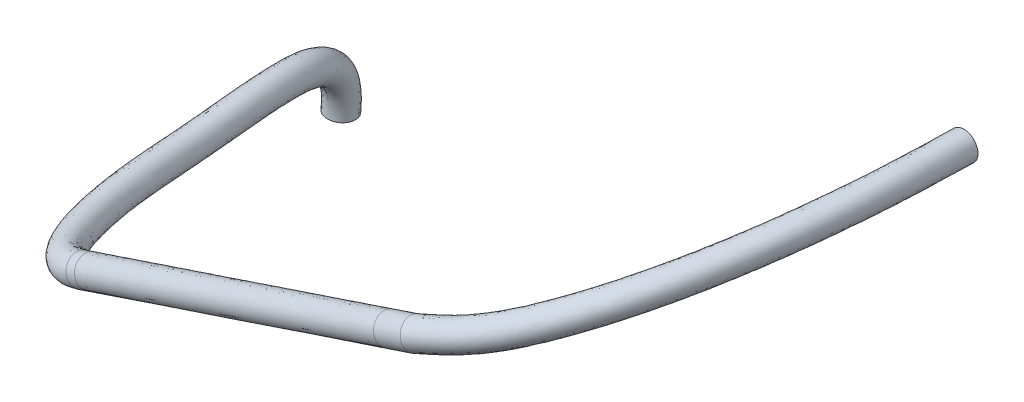
ISO-10303-21;
HEADER;
FILE_DESCRIPTION(('STEP AP214'),'2;1');
FILE_NAME('part.step','',(''),(''),'','','');
FILE_SCHEMA(('AUTOMOTIVE_DESIGN { 1 0 10303 214 1 1 1 1 }'));
ENDSEC;
DATA;
#1=APPLICATION_CONTEXT('core data for automotive mechanical design processes');
#2=APPLICATION_PROTOCOL_DEFINITION('international standard','automotive_design',2000,#1);
#3=PRODUCT_CONTEXT('',#1,'mechanical');
#4=PRODUCT('Part','Part','',(#3));
#5=PRODUCT_RELATED_PRODUCT_CATEGORY('part','',(#4));
#6=PRODUCT_DEFINITION_FORMATION('','',#4);
#7=PRODUCT_DEFINITION_CONTEXT('part definition',#1,'design');
#8=PRODUCT_DEFINITION('design','',#6,#7);
#9=PRODUCT_DEFINITION_SHAPE('','',#8);
#10=(LENGTH_UNIT() NAMED_UNIT(*) SI_UNIT(.MILLI.,.METRE.));
#11=(NAMED_UNIT(*) PLANE_ANGLE_UNIT() SI_UNIT($,.RADIAN.));
#12=(NAMED_UNIT(*) SI_UNIT($,.STERADIAN.) SOLID_ANGLE_UNIT());
#13=UNCERTAINTY_MEASURE_WITH_UNIT(LENGTH_MEASURE(1.E-05),#10,'distance_accuracy_value','');
#14=(GEOMETRIC_REPRESENTATION_CONTEXT(3) GLOBAL_UNCERTAINTY_ASSIGNED_CONTEXT((#13)) GLOBAL_UNIT_ASSIGNED_CONTEXT((#10,
#11,#12)) REPRESENTATION_CONTEXT('',''));
#15=CARTESIAN_POINT('',(0.,0.,0.));
#16=DIRECTION('',(0.,0.,1.));
#17=DIRECTION('',(1.,0.,0.));
#18=AXIS2_PLACEMENT_3D('',#15,#16,#17);
#19=CARTESIAN_POINT('',(81.1487898787396,61.1718176723532,90.0772563457402));
#20=CARTESIAN_POINT('',(82.8684623420464,57.4975112605607,86.2286481315393));
#21=CARTESIAN_POINT('',(81.7486279189325,61.2128646400633,82.1931883269978));
#22=CARTESIAN_POINT('',(80.0289554556256,64.8871710518557,86.0417965411987));
#23=CARTESIAN_POINT('',(78.3092829923188,68.5614774636482,89.8904047553996));
#24=CARTESIAN_POINT('',(79.4291174154327,64.8461240841457,93.9258645599411));
#25=CARTESIAN_POINT('',(81.1487898787396,61.1718176723532,90.0772563457402));
#26=(BOUNDED_CURVE() B_SPLINE_CURVE(3,(#19,#20,#21,#22,#23,#24,#25),.UNSPECIFIED.,.T.,
.F.) B_SPLINE_CURVE_WITH_KNOTS((4,3,4),(0.,0.5,1.),
.UNSPECIFIED.) CURVE() GEOMETRIC_REPRESENTATION_ITEM() RATIONAL_B_SPLINE_CURVE((1.,
0.333333333333333,0.333333333333333,1.,0.333333333333333,0.333333333333333,1.)) REPRESENTATION_ITEM(''));
#27=DIRECTION('',(-0.930375009445615,-0.359337532617031,-0.0726558975705086));
#28=VECTOR('',#27,1.);
#29=SURFACE_OF_LINEAR_EXTRUSION('',#26,#28);
#30=CARTESIAN_POINT('',(81.1487898787396,61.1718176723532,90.0772563457402));
#31=VERTEX_POINT('',#30);
#32=EDGE_CURVE('E44',#31,#31,#26,.F.);
#33=ORIENTED_EDGE('',*,*,#32,.T.);
#34=EDGE_LOOP('',(#33));
#35=FACE_BOUND('',#34,.T.);
#36=CARTESIAN_POINT('',(16.9410739490081,36.3729548665765,85.0630747689944));
#37=CARTESIAN_POINT('',(18.6607464123149,32.6986484547841,81.2144665547935));
#38=CARTESIAN_POINT('',(17.540911989201,36.4140018342866,77.179006750252));
#39=CARTESIAN_POINT('',(15.8212395258941,40.0883082460791,81.0276149644529));
#40=CARTESIAN_POINT('',(14.1015670625873,43.7626146578715,84.8762231786538));
#41=CARTESIAN_POINT('',(15.2214014857012,40.047261278369,88.9116829831953));
#42=CARTESIAN_POINT('',(16.9410739490081,36.3729548665765,85.0630747689944));
#43=(BOUNDED_CURVE() B_SPLINE_CURVE(3,(#36,#37,#38,#39,#40,#41,#42),.UNSPECIFIED.,.T.,
.F.) B_SPLINE_CURVE_WITH_KNOTS((4,3,4),(0.,0.5,1.),
.UNSPECIFIED.) CURVE() GEOMETRIC_REPRESENTATION_ITEM() RATIONAL_B_SPLINE_CURVE((1.,
0.333333333333333,0.333333333333333,1.,0.333333333333333,0.333333333333333,1.)) REPRESENTATION_ITEM(''));
#44=CARTESIAN_POINT('',(16.9410739490081,36.3729548665765,85.0630747689944));
#45=VERTEX_POINT('',#44);
#46=EDGE_CURVE('E10',#45,#45,#43,.F.);
#47=ORIENTED_EDGE('',*,*,#46,.F.);
#48=EDGE_LOOP('',(#47));
#49=FACE_BOUND('',#48,.T.);
#50=ADVANCED_FACE('F31',(#35,#49),#29,.F.);
#51=CARTESIAN_POINT('',(127.925962821787,82.0711595010635,18.81));
#52=CARTESIAN_POINT('',(127.823983410533,82.0828317957309,23.4719247681057));
#53=CARTESIAN_POINT('',(127.629593697571,82.1050811300045,32.3583284684436));
#54=CARTESIAN_POINT('',(125.682951111258,81.200997836729,44.9814579508211));
#55=CARTESIAN_POINT('',(122.694952336225,79.7214212513646,56.1367858951083));
#56=CARTESIAN_POINT('',(118.736979126685,77.7375754693454,65.7998466210036));
#57=CARTESIAN_POINT('',(114.040456126802,75.3827841757599,73.898083873457));
#58=CARTESIAN_POINT('',(108.740449221545,72.8307716458052,80.4351231122459));
#59=CARTESIAN_POINT('',(102.962150007868,69.9655958387675,85.5477060111618));
#60=CARTESIAN_POINT('',(95.4453699171,66.5124875820573,89.2722557636218));
#61=CARTESIAN_POINT('',(89.9003788054978,64.4870541830407,90.0722609856724));
#62=CARTESIAN_POINT('',(86.8044611116505,63.3562002336801,90.5189254207035));
#63=CARTESIAN_POINT('',(127.925962821787,87.6711595010636,18.81));
#64=CARTESIAN_POINT('',(127.842628451485,87.6809281054721,23.5882891743731));
#65=CARTESIAN_POINT('',(127.683779286505,87.6995486896045,32.6965027798207));
#66=CARTESIAN_POINT('',(125.755880367147,86.7582603622867,45.7088070545845));
#67=CARTESIAN_POINT('',(122.752764542969,85.2114045236135,57.2713491042322));
#68=CARTESIAN_POINT('',(118.727627037371,83.1268193710605,67.3512357283454));
#69=CARTESIAN_POINT('',(113.936600520975,80.6255240420923,75.8919718712892));
#70=CARTESIAN_POINT('',(108.392619492622,77.9025429718673,82.808945292704));
#71=CARTESIAN_POINT('',(102.537725110809,74.7419142966342,88.498015975164));
#72=CARTESIAN_POINT('',(94.4962399384647,70.6744029880479,92.9511883267719));
#73=CARTESIAN_POINT('',(88.7264873455061,68.4402324539288,93.8811389805609));
#74=CARTESIAN_POINT('',(85.5050792706968,67.192834947163,94.4003554455695));
#75=CARTESIAN_POINT('',(122.325962821787,87.6711595010636,18.81));
#76=CARTESIAN_POINT('',(122.247849491193,87.7057389780103,23.3945051131076));
#77=CARTESIAN_POINT('',(122.098952495947,87.7716532102601,32.1333340792153));
#78=CARTESIAN_POINT('',(120.275041320305,86.9705008892944,44.5162682266653));
#79=CARTESIAN_POINT('',(117.456709166976,85.624144716275,55.4486819783905));
#80=CARTESIAN_POINT('',(113.71629298745,83.800158808086,64.9043958174087));
#81=CARTESIAN_POINT('',(109.306268719857,81.6513943925075,72.8680608998156));
#82=CARTESIAN_POINT('',(104.294538163757,79.2753459191902,79.2210207630465));
#83=CARTESIAN_POINT('',(99.0311709998939,76.788726614224,84.5448095344949));
#84=CARTESIAN_POINT('',(92.400027639222,73.8226840719556,88.7121205325197));
#85=CARTESIAN_POINT('',(87.0654286178147,71.8784868845835,89.7577821041041));
#86=CARTESIAN_POINT('',(84.0869784873179,70.7929892973793,90.3416030870577));
#87=CARTESIAN_POINT('',(122.325962821787,82.0711595010635,18.81));
#88=CARTESIAN_POINT('',(122.229204450241,82.1076426682692,23.2781407068402));
#89=CARTESIAN_POINT('',(122.044766907013,82.1771856506601,31.7951597678383));
#90=CARTESIAN_POINT('',(120.202112064416,81.4132383637366,43.7889191229019));
#91=CARTESIAN_POINT('',(117.398896960232,80.1341614440261,54.3141187692666));
#92=CARTESIAN_POINT('',(113.725645076764,78.4109149063709,63.353006710067));
#93=CARTESIAN_POINT('',(109.410124325685,76.4086545261751,70.8741729019834));
#94=CARTESIAN_POINT('',(104.64236789268,74.2035745931281,76.8471985825884));
#95=CARTESIAN_POINT('',(99.455595896953,72.0124081563574,81.5944995704927));
#96=CARTESIAN_POINT('',(93.3491576178572,69.6607686659649,85.0331879693696));
#97=CARTESIAN_POINT('',(88.2393200778063,67.9253086136954,85.9489041092156));
#98=CARTESIAN_POINT('',(85.3863603282716,66.9563545838965,86.4601730621917));
#99=CARTESIAN_POINT('',(122.325962821787,76.4711595010635,18.81));
#100=CARTESIAN_POINT('',(122.210559409289,76.509546358528,23.1617763005728));
#101=CARTESIAN_POINT('',(121.990581318079,76.5827180910601,31.4569854564612));
#102=CARTESIAN_POINT('',(120.129182808528,75.8559758381788,43.0615700191385));
#103=CARTESIAN_POINT('',(117.341084753488,74.6441781717771,53.1795555601428));
#104=CARTESIAN_POINT('',(113.734997166078,73.0216710046558,61.8016176027252));
#105=CARTESIAN_POINT('',(109.513979931512,71.1659146598427,68.8802849041511));
#106=CARTESIAN_POINT('',(104.990197621603,69.131803267066,74.4733764021303));
#107=CARTESIAN_POINT('',(99.8800207940121,67.2360896984908,78.6441896064906));
#108=CARTESIAN_POINT('',(94.2982875964925,65.4988532599743,81.3542554062196));
#109=CARTESIAN_POINT('',(89.4132115377979,63.9721303428073,82.1400261143271));
#110=CARTESIAN_POINT('',(86.6857421692253,63.1197198704136,82.5787430373257));
#111=CARTESIAN_POINT('',(127.925962821787,76.4711595010635,18.81));
#112=CARTESIAN_POINT('',(127.805338369581,76.4847354859897,23.3555603618383));
#113=CARTESIAN_POINT('',(127.575408108637,76.5106135704046,32.0201541570666));
#114=CARTESIAN_POINT('',(125.61002185537,75.6437353111711,44.2541088470577));
#115=CARTESIAN_POINT('',(122.637140129481,74.2314379791157,55.0022226859844));
#116=CARTESIAN_POINT('',(118.746331216,72.3483315676303,64.2484575136619));
#117=CARTESIAN_POINT('',(114.14431173263,70.1400443094275,71.9041958756248));
#118=CARTESIAN_POINT('',(109.088278950468,67.7590003197431,78.0613009317878));
#119=CARTESIAN_POINT('',(103.386574904927,65.1892773809009,82.5973960471596));
#120=CARTESIAN_POINT('',(96.3944998957352,62.3505721760666,85.5933232004718));
#121=CARTESIAN_POINT('',(91.0742702654893,60.5338759121526,86.2633829907839));
#122=CARTESIAN_POINT('',(88.1038429526042,59.5195655201973,86.6374953958375));
#123=CARTESIAN_POINT('',(127.925962821787,82.0711595010635,18.81));
#124=CARTESIAN_POINT('',(127.823983410533,82.0828317957309,23.4719247681057));
#125=CARTESIAN_POINT('',(127.629593697571,82.1050811300045,32.3583284684436));
#126=CARTESIAN_POINT('',(125.682951111258,81.200997836729,44.9814579508211));
#127=CARTESIAN_POINT('',(122.694952336225,79.7214212513646,56.1367858951083));
#128=CARTESIAN_POINT('',(118.736979126685,77.7375754693454,65.7998466210036));
#129=CARTESIAN_POINT('',(114.040456126802,75.3827841757599,73.898083873457));
#130=CARTESIAN_POINT('',(108.740449221545,72.8307716458052,80.4351231122459));
#131=CARTESIAN_POINT('',(102.962150007868,69.9655958387675,85.5477060111618));
#132=CARTESIAN_POINT('',(95.4453699171,66.5124875820573,89.2722557636218));
#133=CARTESIAN_POINT('',(89.9003788054978,64.4870541830407,90.0722609856724));
#134=CARTESIAN_POINT('',(86.8044611116505,63.3562002336801,90.5189254207035));
#135=(BOUNDED_SURFACE() B_SPLINE_SURFACE(3,3,((#51,#52,#53,#54,#55,#56,#57,#58,#59,#60,#61,#62),
(#63,#64,#65,#66,#67,#68,#69,#70,#71,#72,#73,#74),(#75,#76,#77,#78,#79,#80,#81,#82,#83,#84,#85,
#86),(#87,#88,#89,#90,#91,#92,#93,#94,#95,#96,#97,#98),(#99,#100,#101,#102,#103,#104,#105,#106,
#107,#108,#109,#110),(#111,#112,#113,#114,#115,#116,#117,#118,#119,#120,#121,#122),(#123,#124,
#125,#126,#127,#128,#129,#130,#131,#132,#133,#134)),.UNSPECIFIED.,.T.,.F.,
.F.) B_SPLINE_SURFACE_WITH_KNOTS((4,3,4),(4,1,1,1,1,1,1,1,1,4),(0.,0.5,1.),(0.,0.1523876811027,
0.290476256181029,0.415797899749065,0.529647461180281,0.633091550657314,0.725417629481519,
0.80947455062777,0.893624516619064,1.),
.UNSPECIFIED.) GEOMETRIC_REPRESENTATION_ITEM() RATIONAL_B_SPLINE_SURFACE(((1.,1.,1.,1.,1.,1.,1.,
1.,1.,1.,1.,1.),(0.333333333333333,0.333333333333333,0.333333333333333,0.333333333333333,
0.333333333333333,0.333333333333333,0.333333333333333,0.333333333333333,0.333333333333333,
0.333333333333333,0.333333333333333,0.333333333333333),(0.333333333333333,0.333333333333333,
0.333333333333333,0.333333333333333,0.333333333333333,0.333333333333333,0.333333333333333,
0.333333333333333,0.333333333333333,0.333333333333333,0.333333333333333,0.333333333333333),(1.,
1.,1.,1.,1.,1.,1.,1.,1.,1.,1.,1.),(0.333333333333333,0.333333333333333,0.333333333333333,
0.333333333333333,0.333333333333333,0.333333333333333,0.333333333333333,0.333333333333333,
0.333333333333333,0.333333333333333,0.333333333333333,0.333333333333333),(0.333333333333333,
0.333333333333333,0.333333333333333,0.333333333333333,0.333333333333333,0.333333333333333,
0.333333333333333,0.333333333333333,0.333333333333333,0.333333333333333,0.333333333333333,
0.333333333333333),(1.,1.,1.,1.,1.,1.,1.,1.,1.,1.,1.,1.))) REPRESENTATION_ITEM('') SURFACE());
#136=CARTESIAN_POINT('',(125.125962821787,82.0711595010635,18.81));
#137=DIRECTION('',(0.,0.,1.));
#138=DIRECTION('',(1.,0.,0.));
#139=AXIS2_PLACEMENT_3D('',#136,#137,#138);
#140=CIRCLE('',#139,2.80000000000003);
#141=CARTESIAN_POINT('',(127.925962821787,82.0711595010635,18.81));
#142=VERTEX_POINT('',#141);
#143=EDGE_CURVE('E40',#142,#142,#140,.T.);
#144=CARTESIAN_POINT('',(86.8044611116505,63.3562002336801,90.5189254207035));
#145=CARTESIAN_POINT('',(88.1038429526042,59.5195655201973,86.6374953958375));
#146=CARTESIAN_POINT('',(86.6857421692253,63.1197198704136,82.5787430373257));
#147=CARTESIAN_POINT('',(85.3863603282716,66.9563545838965,86.4601730621917));
#148=CARTESIAN_POINT('',(84.0869784873179,70.7929892973793,90.3416030870577));
#149=CARTESIAN_POINT('',(85.5050792706968,67.192834947163,94.4003554455695));
#150=CARTESIAN_POINT('',(86.8044611116505,63.3562002336801,90.5189254207035));
#151=(BOUNDED_CURVE() B_SPLINE_CURVE(3,(#144,#145,#146,#147,#148,#149,#150),.UNSPECIFIED.,.T.,
.F.) B_SPLINE_CURVE_WITH_KNOTS((4,3,4),(0.,0.5,1.),
.UNSPECIFIED.) CURVE() GEOMETRIC_REPRESENTATION_ITEM() RATIONAL_B_SPLINE_CURVE((1.,
0.333333333333333,0.333333333333333,1.,0.333333333333333,0.333333333333333,1.)) REPRESENTATION_ITEM(''));
#152=CARTESIAN_POINT('',(86.8044611116505,63.3562002336801,90.5189254207035));
#153=VERTEX_POINT('',#152);
#154=EDGE_CURVE('E48',#153,#153,#151,.T.);
#155=ORIENTED_EDGE('',*,*,#143,.T.);
#156=EDGE_LOOP('',(#155));
#157=FACE_BOUND('',#156,.T.);
#158=ORIENTED_EDGE('',*,*,#154,.T.);
#159=EDGE_LOOP('',(#158));
#160=FACE_BOUND('',#159,.T.);
#161=ADVANCED_FACE('F97',(#157,#160),#135,.T.);
#162=CARTESIAN_POINT('',(125.125962821787,82.0711595010635,18.81));
#163=DIRECTION('',(0.,0.,1.));
#164=DIRECTION('',(1.,0.,0.));
#165=AXIS2_PLACEMENT_3D('',#162,#163,#164);
#166=PLANE('',#165);
#167=ORIENTED_EDGE('',*,*,#143,.F.);
#168=EDGE_LOOP('',(#167));
#169=FACE_BOUND('',#168,.T.);
#170=ADVANCED_FACE('F102',(#169),#166,.F.);
#171=CARTESIAN_POINT('',(86.8044611116505,63.3562002336801,90.5189254207035));
#172=CARTESIAN_POINT('',(81.1487898787396,61.1718176723532,90.0772563457402));
#173=CARTESIAN_POINT('',(88.1038429526042,59.5195655201973,86.6374953958375));
#174=CARTESIAN_POINT('',(82.8684623420464,57.4975112605607,86.2286481315393));
#175=CARTESIAN_POINT('',(86.6857421692253,63.1197198704136,82.5787430373257));
#176=CARTESIAN_POINT('',(81.7486279189325,61.2128646400633,82.1931883269978));
#177=CARTESIAN_POINT('',(85.3863603282716,66.9563545838965,86.4601730621917));
#178=CARTESIAN_POINT('',(80.0289554556256,64.8871710518557,86.0417965411987));
#179=CARTESIAN_POINT('',(84.0869784873179,70.7929892973793,90.3416030870577));
#180=CARTESIAN_POINT('',(78.3092829923188,68.5614774636482,89.8904047553996));
#181=CARTESIAN_POINT('',(85.5050792706968,67.192834947163,94.4003554455695));
#182=CARTESIAN_POINT('',(79.4291174154327,64.8461240841457,93.9258645599411));
#183=CARTESIAN_POINT('',(86.8044611116505,63.3562002336801,90.5189254207035));
#184=CARTESIAN_POINT('',(81.1487898787396,61.1718176723532,90.0772563457402));
#185=(BOUNDED_SURFACE() B_SPLINE_SURFACE(3,1,((#171,#172),(#173,#174),(#175,#176),(#177,#178),
(#179,#180),(#181,#182),(#183,#184)),.UNSPECIFIED.,.T.,.F.,.F.) B_SPLINE_SURFACE_WITH_KNOTS((4,
3,4),(2,2),(0.,0.5,1.),(0.,1.),
.UNSPECIFIED.) GEOMETRIC_REPRESENTATION_ITEM() RATIONAL_B_SPLINE_SURFACE(((1.,1.),
(0.333333333333333,0.333333333333333),(0.333333333333333,0.333333333333333),(1.,1.),
(0.333333333333333,0.333333333333333),(0.333333333333333,0.333333333333333),(1.,1.))) REPRESENTATION_ITEM('') SURFACE());
#186=ORIENTED_EDGE('',*,*,#154,.F.);
#187=EDGE_LOOP('',(#186));
#188=FACE_BOUND('',#187,.T.);
#189=ORIENTED_EDGE('',*,*,#32,.F.);
#190=EDGE_LOOP('',(#189));
#191=FACE_BOUND('',#190,.T.);
#192=ADVANCED_FACE('F94',(#188,#191),#185,.F.);
#193=CARTESIAN_POINT('',(16.9410739490081,36.3729548665765,85.0630747689944));
#194=CARTESIAN_POINT('',(15.0916055474745,35.6586370857752,84.9186439906765));
#195=CARTESIAN_POINT('',(15.2214014857012,40.047261278369,88.9116829831953));
#196=CARTESIAN_POINT('',(13.406735895858,39.3463853423657,88.7699700654129));
#197=CARTESIAN_POINT('',(14.1015670625873,43.7626146578715,84.8762231786538));
#198=CARTESIAN_POINT('',(12.288018793997,43.0621702634058,84.7345975159864));
#199=CARTESIAN_POINT('',(15.8212395258941,40.0883082460791,81.0276149644529));
#200=CARTESIAN_POINT('',(13.9728884456134,39.3744220068153,80.8832714412501));
#201=CARTESIAN_POINT('',(17.540911989201,36.4140018342866,77.179006750252));
#202=CARTESIAN_POINT('',(15.6577580972299,35.6866737502248,77.0319453665137));
#203=CARTESIAN_POINT('',(18.6607464123149,32.6986484547841,81.2144665547935));
#204=CARTESIAN_POINT('',(16.776475199091,31.9708888291846,81.0673179159402));
#205=CARTESIAN_POINT('',(16.9410739490081,36.3729548665765,85.0630747689944));
#206=CARTESIAN_POINT('',(15.0916055474745,35.6586370857752,84.9186439906765));
#207=(BOUNDED_SURFACE() B_SPLINE_SURFACE(3,1,((#193,#194),(#195,#196),(#197,#198),(#199,#200),
(#201,#202),(#203,#204),(#205,#206)),.UNSPECIFIED.,.T.,.F.,.F.) B_SPLINE_SURFACE_WITH_KNOTS((4,
3,4),(2,2),(0.,0.5,1.),(0.,1.),
.UNSPECIFIED.) GEOMETRIC_REPRESENTATION_ITEM() RATIONAL_B_SPLINE_SURFACE(((1.,1.),
(0.333333333333333,0.333333333333333),(0.333333333333333,0.333333333333333),(1.,1.),
(0.333333333333333,0.333333333333333),(0.333333333333333,0.333333333333333),(1.,1.))) REPRESENTATION_ITEM('') SURFACE());
#208=CARTESIAN_POINT('',(15.0916055474745,35.6586370857752,84.9186439906765));
#209=CARTESIAN_POINT('',(16.776475199091,31.9708888291846,81.0673179159402));
#210=CARTESIAN_POINT('',(15.6577580972299,35.6866737502248,77.0319453665137));
#211=CARTESIAN_POINT('',(13.9728884456134,39.3744220068153,80.8832714412501));
#212=CARTESIAN_POINT('',(12.288018793997,43.0621702634058,84.7345975159864));
#213=CARTESIAN_POINT('',(13.406735895858,39.3463853423657,88.7699700654129));
#214=CARTESIAN_POINT('',(15.0916055474745,35.6586370857752,84.9186439906765));
#215=(BOUNDED_CURVE() B_SPLINE_CURVE(3,(#208,#209,#210,#211,#212,#213,#214),.UNSPECIFIED.,.T.,
.F.) B_SPLINE_CURVE_WITH_KNOTS((4,3,4),(0.,0.5,1.),
.UNSPECIFIED.) CURVE() GEOMETRIC_REPRESENTATION_ITEM() RATIONAL_B_SPLINE_CURVE((1.,
0.333333333333333,0.333333333333333,1.,0.333333333333333,0.333333333333333,1.)) REPRESENTATION_ITEM(''));
#216=CARTESIAN_POINT('',(15.0916055474745,35.6586370857752,84.9186439906765));
#217=VERTEX_POINT('',#216);
#218=EDGE_CURVE('E68',#217,#217,#215,.T.);
#219=ORIENTED_EDGE('',*,*,#46,.T.);
#220=EDGE_LOOP('',(#219));
#221=FACE_BOUND('',#220,.T.);
#222=ORIENTED_EDGE('',*,*,#218,.T.);
#223=EDGE_LOOP('',(#222));
#224=FACE_BOUND('',#223,.T.);
#225=ADVANCED_FACE('F80',(#221,#224),#207,.T.);
#226=CARTESIAN_POINT('',(-3.58870525397693,19.3799806151552,9.68126563882055));
#227=DIRECTION('',(-0.0589225886440151,-0.997245334327439,0.0450540975899289));
#228=DIRECTION('',(0.998259017870274,-0.0589824824899461,0.));
#229=AXIS2_PLACEMENT_3D('',#226,#227,#228);
#230=PLANE('',#229);
#231=CARTESIAN_POINT('',(-6.34580805392456,19.7623383869717,14.5387343611794));
#232=CARTESIAN_POINT('',(-1.49424413226242,19.6010955640268,17.31468725006));
#233=CARTESIAN_POINT('',(1.26285866768524,19.2187377922104,12.4572185277012));
#234=CARTESIAN_POINT('',(-3.58870525397693,19.3799806151552,9.68126563882055));
#235=CARTESIAN_POINT('',(-8.44026917563902,19.5412234381001,6.90531274993987));
#236=CARTESIAN_POINT('',(-11.1973719755867,19.9235812099165,11.7627814722987));
#237=CARTESIAN_POINT('',(-6.34580805392456,19.7623383869717,14.5387343611794));
#238=(BOUNDED_CURVE() B_SPLINE_CURVE(3,(#231,#232,#233,#234,#235,#236,#237),.UNSPECIFIED.,.T.,
.F.) B_SPLINE_CURVE_WITH_KNOTS((4,3,4),(0.,0.5,1.),
.UNSPECIFIED.) CURVE() GEOMETRIC_REPRESENTATION_ITEM() RATIONAL_B_SPLINE_CURVE((1.,
0.333333333333333,0.333333333333333,1.,0.333333333333333,0.333333333333333,1.)) REPRESENTATION_ITEM(''));
#239=CARTESIAN_POINT('',(-6.34580805392456,19.7623383869717,14.5387343611794));
#240=VERTEX_POINT('',#239);
#241=EDGE_CURVE('E60',#240,#240,#238,.F.);
#242=ORIENTED_EDGE('',*,*,#241,.T.);
#243=EDGE_LOOP('',(#242));
#244=FACE_BOUND('',#243,.T.);
#245=ADVANCED_FACE('F85',(#244),#230,.T.);
#246=CARTESIAN_POINT('',(15.0916055474745,35.6586370857752,84.9186439906765));
#247=CARTESIAN_POINT('',(14.4273065334605,35.4096595534953,84.8733351624054));
#248=CARTESIAN_POINT('',(12.6409253101334,34.7655393437095,84.5921666598122));
#249=CARTESIAN_POINT('',(10.4698919916281,34.0285965469515,83.6428127037452));
#250=CARTESIAN_POINT('',(8.1405537702827,33.2908141864133,82.0104105205428));
#251=CARTESIAN_POINT('',(5.96680963659307,32.6775421016906,79.5631192173669));
#252=CARTESIAN_POINT('',(3.34694315379664,32.0533467679456,75.1656243302604));
#253=CARTESIAN_POINT('',(1.08503986924065,31.7514194357975,68.9834357178448));
#254=CARTESIAN_POINT('',(-1.53977976970221,31.8400706894773,58.6094779221342));
#255=CARTESIAN_POINT('',(-2.41345021588255,30.9918898220495,44.3631675275283));
#256=CARTESIAN_POINT('',(-3.8064444102828,31.6930785120833,31.5680604268983));
#257=CARTESIAN_POINT('',(-4.60555026678838,30.4666596032205,23.4696961394359));
#258=CARTESIAN_POINT('',(-5.02882905036672,29.5626452581332,20.2380937845374));
#259=CARTESIAN_POINT('',(-5.36233988923994,28.392567473471,18.0421359626241));
#260=CARTESIAN_POINT('',(-5.6005526182333,27.2136696903821,16.708567085588));
#261=CARTESIAN_POINT('',(-5.76655868997784,26.192513433301,15.8950342350056));
#262=CARTESIAN_POINT('',(-5.92517998666703,24.977158525568,15.249793163342));
#263=CARTESIAN_POINT('',(-6.07691115714467,23.5260646937247,14.7806892527424));
#264=CARTESIAN_POINT('',(-6.22527431074715,21.7268393963454,14.5191790480603));
#265=CARTESIAN_POINT('',(-6.29963187812591,20.5438548975665,14.5034265789071));
#266=CARTESIAN_POINT('',(-6.34580805392456,19.7623383869717,14.5387343611794));
#267=CARTESIAN_POINT('',(16.776475199091,31.9708888291846,81.0673179159402));
#268=CARTESIAN_POINT('',(16.5462151775183,31.8845879755864,81.0516129223227));
#269=CARTESIAN_POINT('',(14.919906634857,31.2749526955553,80.8572867117918));
#270=CARTESIAN_POINT('',(13.5556984063791,30.8005508048547,80.2368692273197));
#271=CARTESIAN_POINT('',(11.8347671578923,30.2244962861226,79.111145463405));
#272=CARTESIAN_POINT('',(10.1337485213269,29.6997948135081,77.2756696079367));
#273=CARTESIAN_POINT('',(7.82750280671491,29.0446659041971,73.6365692856414));
#274=CARTESIAN_POINT('',(5.50019354439078,28.3897969997291,68.0751266929208));
#275=CARTESIAN_POINT('',(2.03320180374379,27.4747262106418,58.3537592557466));
#276=CARTESIAN_POINT('',(1.75435739588179,27.2777429729811,44.209443878826));
#277=CARTESIAN_POINT('',(-0.176893588889569,27.4117945399064,31.078157141209));
#278=CARTESIAN_POINT('',(-0.455683158346842,26.7116623991058,23.6393012453005));
#279=CARTESIAN_POINT('',(-0.758305902396016,25.9947367604077,20.9232235830097));
#280=CARTESIAN_POINT('',(-0.952190591708357,25.1925169937133,19.3891150701557));
#281=CARTESIAN_POINT('',(-1.06856287852151,24.5282910334566,18.6173554815354));
#282=CARTESIAN_POINT('',(-1.1430669610796,24.0025319683408,18.1801590956322));
#283=CARTESIAN_POINT('',(-1.21988399937098,23.3375397866139,17.8176837200163));
#284=CARTESIAN_POINT('',(-1.30215771211609,22.4973786543643,17.5096733615195));
#285=CARTESIAN_POINT('',(-1.41476639555151,21.0025315801503,17.3193717511541));
#286=CARTESIAN_POINT('',(-1.43117613004102,20.6685006527718,17.26646343654));
#287=CARTESIAN_POINT('',(-1.49424413226242,19.6010955640268,17.31468725006));
#288=CARTESIAN_POINT('',(15.6577580972299,35.6866737502248,77.0319453665137));
#289=CARTESIAN_POINT('',(15.4274980756573,35.6003728966266,77.0162403728963));
#290=CARTESIAN_POINT('',(14.7754177716139,35.3291511490747,76.9263788657681));
#291=CARTESIAN_POINT('',(14.1288399633744,35.0781415744632,76.6466658973668));
#292=CARTESIAN_POINT('',(13.2850378542538,34.7539865090007,76.0852878301814));
#293=CARTESIAN_POINT('',(12.210894555927,34.3601646965442,74.9231403633161));
#294=CARTESIAN_POINT('',(10.5036095646843,33.747865874917,72.0884192221417));
#295=CARTESIAN_POINT('',(8.71544871351802,32.8915022828229,67.0383047504924));
#296=CARTESIAN_POINT('',(6.35936377939834,31.0537133455059,57.6587803506289));
#297=CARTESIAN_POINT('',(5.46101233131592,31.4402846525455,43.8924158604858));
#298=CARTESIAN_POINT('',(4.07424357549352,31.1341229888738,30.8209000803369));
#299=CARTESIAN_POINT('',(3.22761540309923,30.7612864818801,22.4141191275151));
#300=CARTESIAN_POINT('',(2.76938978483998,29.9183436415504,18.975117600708));
#301=CARTESIAN_POINT('',(2.39496813730723,28.7151593413362,16.5372615595863));
#302=CARTESIAN_POINT('',(2.11754067824637,27.4103577958986,14.9986626892211));
#303=CARTESIAN_POINT('',(1.9218808816968,26.2571389584207,14.0461646634684));
#304=CARTESIAN_POINT('',(1.7353989686012,24.873384314254,13.2921781646856));
#305=CARTESIAN_POINT('',(1.56237594217819,23.2832835741078,12.7495684628274));
#306=CARTESIAN_POINT('',(1.38977899555274,21.204615847952,12.4573702967968));
#307=CARTESIAN_POINT('',(1.32592666990665,20.2861428809554,12.4089947141812));
#308=CARTESIAN_POINT('',(1.26285866768524,19.2187377922104,12.4572185277012));
#309=CARTESIAN_POINT('',(13.9728884456134,39.3744220068153,80.8832714412501));
#310=CARTESIAN_POINT('',(13.5256089278201,39.2067828138763,80.8527645303058));
#311=CARTESIAN_POINT('',(12.4007766845518,38.7838847685762,80.6547342944803));
#312=CARTESIAN_POINT('',(11.0675297506549,38.3153684290752,80.054280148827));
#313=CARTESIAN_POINT('',(9.58024533378637,37.8163393775716,78.9838313325822));
#314=CARTESIAN_POINT('',(8.04744483724665,37.3392197175647,77.210827952839));
#315=CARTESIAN_POINT('',(6.0207740343114,36.7556937306719,73.6173190402219));
#316=CARTESIAN_POINT('',(4.30111282838729,36.2534313612126,67.946669546289));
#317=CARTESIAN_POINT('',(2.78588998797041,35.4188725809052,57.9144654833734));
#318=CARTESIAN_POINT('',(1.29340566170862,35.1545134269309,44.0461528817717));
#319=CARTESIAN_POINT('',(0.444680895250333,35.4153841486353,31.310803481506));
#320=CARTESIAN_POINT('',(-0.922249892889294,34.5162969668652,22.2445135111224));
#321=CARTESIAN_POINT('',(-1.50113624391051,33.4862075847206,18.289989793531));
#322=CARTESIAN_POINT('',(-2.01517411120749,31.9153286428586,15.1902770863317));
#323=CARTESIAN_POINT('',(-2.41446077297982,30.0955383281866,13.0898832438002));
#324=CARTESIAN_POINT('',(-2.70156505608963,28.4478953979195,11.7610047907443));
#325=CARTESIAN_POINT('',(-2.97008199154585,26.5098724562083,10.7244290438047));
#326=CARTESIAN_POINT('',(-3.21159217066963,24.32526109873,10.0199838640387));
#327=CARTESIAN_POINT('',(-3.42419476027147,21.8702654580145,9.65982768636183));
#328=CARTESIAN_POINT('',(-3.5340831649669,20.3044414148252,9.63949984092441));
#329=CARTESIAN_POINT('',(-3.58870525397693,19.3799806151552,9.68126563882055));
#330=CARTESIAN_POINT('',(12.288018793997,43.0621702634058,84.7345975159864));
#331=CARTESIAN_POINT('',(11.623719779983,42.813192731126,84.6892886877153));
#332=CARTESIAN_POINT('',(10.0261355974897,42.2386183880776,84.3830897231926));
#333=CARTESIAN_POINT('',(8.00621953793536,41.5525952836873,83.461894400287));
#334=CARTESIAN_POINT('',(5.87545281331904,40.8786922461425,81.882374834983));
#335=CARTESIAN_POINT('',(3.88399511856641,40.3182747385851,79.4985155423618));
#336=CARTESIAN_POINT('',(1.53793850393854,39.7635215864269,75.1462188583021));
#337=CARTESIAN_POINT('',(-0.113223056743408,39.6153604396022,68.8550343420857));
#338=CARTESIAN_POINT('',(-0.787583803457447,39.7840318163045,58.1701506161179));
#339=CARTESIAN_POINT('',(-2.87420100789855,38.8687422013164,44.1998899030576));
#340=CARTESIAN_POINT('',(-3.18488178499286,39.6966453083969,31.8007068826752));
#341=CARTESIAN_POINT('',(-5.07211518887773,38.2713074518502,22.0749078947297));
#342=CARTESIAN_POINT('',(-5.77166227266091,37.0540715278909,17.6048619863539));
#343=CARTESIAN_POINT('',(-6.42531635972217,35.1154979443811,13.8432926130771));
#344=CARTESIAN_POINT('',(-6.94646222420594,32.7807188604746,11.1811037983793));
#345=CARTESIAN_POINT('',(-7.32501099387603,30.6386518374184,9.47584491802024));
#346=CARTESIAN_POINT('',(-7.67556295169283,28.1463605981626,8.15667992292375));
#347=CARTESIAN_POINT('',(-7.98556028351739,25.3672386233521,7.29039926525006));
#348=CARTESIAN_POINT('',(-8.23816851609565,22.5359150680771,6.86228507592685));
#349=CARTESIAN_POINT('',(-8.39409299984037,20.322739948695,6.87000496766758));
#350=CARTESIAN_POINT('',(-8.44026917563902,19.5412234381001,6.90531274993987));
#351=CARTESIAN_POINT('',(13.406735895858,39.3463853423657,88.7699700654129));
#352=CARTESIAN_POINT('',(12.3083978894028,38.9347311314041,88.695057402488));
#353=CARTESIAN_POINT('',(10.3619439854097,38.2561259918638,88.3270466078327));
#354=CARTESIAN_POINT('',(7.38408557687718,37.2566422890482,87.0487561801705));
#355=CARTESIAN_POINT('',(4.44634038267309,36.357132086704,84.9096755776807));
#356=CARTESIAN_POINT('',(1.79987075185929,35.655289389873,81.850568826797));
#357=CARTESIAN_POINT('',(-1.13361649912165,35.0620276316941,76.6946793748795));
#358=CARTESIAN_POINT('',(-3.33011380590947,35.1130418718659,69.8917447427689));
#359=CARTESIAN_POINT('',(-5.11276134314822,36.205415168313,58.8651965885218));
#360=CARTESIAN_POINT('',(-6.58125782764685,34.7060366711178,44.5168911762308));
#361=CARTESIAN_POINT('',(-7.43599523167606,35.9743624842602,32.0579637125875));
#362=CARTESIAN_POINT('',(-8.75541737522992,34.2216568073352,23.3000910335714));
#363=CARTESIAN_POINT('',(-9.29935219833745,33.1305537558588,19.5529639860651));
#364=CARTESIAN_POINT('',(-9.77248918677151,31.5926179532286,16.6951568550925));
#365=CARTESIAN_POINT('',(-10.1325423579451,29.8990483473075,14.7997786896405));
#366=CARTESIAN_POINT('',(-10.3900504188761,28.3824948982612,13.6099093743789));
#367=CARTESIAN_POINT('',(-10.6304759739631,26.6167772645222,12.6819026066678));
#368=CARTESIAN_POINT('',(-10.8516646021733,24.5547507330851,12.0517051439654));
#369=CARTESIAN_POINT('',(-11.0357822259428,22.4511472125404,11.7189863449666));
#370=CARTESIAN_POINT('',(-11.1680876262108,20.4192091423612,11.7403897212742));
#371=CARTESIAN_POINT('',(-11.1973719755867,19.9235812099165,11.7627814722987));
#372=CARTESIAN_POINT('',(15.0916055474745,35.6586370857752,84.9186439906765));
#373=CARTESIAN_POINT('',(14.4273065334605,35.4096595534953,84.8733351624054));
#374=CARTESIAN_POINT('',(12.6409253101334,34.7655393437095,84.5921666598122));
#375=CARTESIAN_POINT('',(10.4698919916281,34.0285965469515,83.6428127037452));
#376=CARTESIAN_POINT('',(8.1405537702827,33.2908141864133,82.0104105205428));
#377=CARTESIAN_POINT('',(5.96680963659307,32.6775421016906,79.5631192173669));
#378=CARTESIAN_POINT('',(3.34694315379664,32.0533467679456,75.1656243302604));
#379=CARTESIAN_POINT('',(1.08503986924065,31.7514194357975,68.9834357178448));
#380=CARTESIAN_POINT('',(-1.53977976970221,31.8400706894773,58.6094779221342));
#381=CARTESIAN_POINT('',(-2.41345021588255,30.9918898220495,44.3631675275283));
#382=CARTESIAN_POINT('',(-3.8064444102828,31.6930785120833,31.5680604268983));
#383=CARTESIAN_POINT('',(-4.60555026678838,30.4666596032205,23.4696961394359));
#384=CARTESIAN_POINT('',(-5.02882905036672,29.5626452581332,20.2380937845374));
#385=CARTESIAN_POINT('',(-5.36233988923994,28.392567473471,18.0421359626241));
#386=CARTESIAN_POINT('',(-5.6005526182333,27.2136696903821,16.708567085588));
#387=CARTESIAN_POINT('',(-5.76655868997784,26.192513433301,15.8950342350056));
#388=CARTESIAN_POINT('',(-5.92517998666703,24.977158525568,15.249793163342));
#389=CARTESIAN_POINT('',(-6.07691115714467,23.5260646937247,14.7806892527424));
#390=CARTESIAN_POINT('',(-6.22527431074715,21.7268393963454,14.5191790480603));
#391=CARTESIAN_POINT('',(-6.29963187812591,20.5438548975665,14.5034265789071));
#392=CARTESIAN_POINT('',(-6.34580805392456,19.7623383869717,14.5387343611794));
#393=(BOUNDED_SURFACE() B_SPLINE_SURFACE(3,3,((#246,#247,#248,#249,#250,#251,#252,#253,#254,
#255,#256,#257,#258,#259,#260,#261,#262,#263,#264,#265,#266),(#267,#268,#269,#270,#271,#272,
#273,#274,#275,#276,#277,#278,#279,#280,#281,#282,#283,#284,#285,#286,#287),(#288,#289,#290,
#291,#292,#293,#294,#295,#296,#297,#298,#299,#300,#301,#302,#303,#304,#305,#306,#307,#308),
(#309,#310,#311,#312,#313,#314,#315,#316,#317,#318,#319,#320,#321,#322,#323,#324,#325,#326,#327,
#328,#329),(#330,#331,#332,#333,#334,#335,#336,#337,#338,#339,#340,#341,#342,#343,#344,#345,
#346,#347,#348,#349,#350),(#351,#352,#353,#354,#355,#356,#357,#358,#359,#360,#361,#362,#363,
#364,#365,#366,#367,#368,#369,#370,#371),(#372,#373,#374,#375,#376,#377,#378,#379,#380,#381,
#382,#383,#384,#385,#386,#387,#388,#389,#390,#391,#392)),.UNSPECIFIED.,.T.,.F.,
.F.) B_SPLINE_SURFACE_WITH_KNOTS((4,3,4),(4,1,1,1,1,1,1,1,1,1,1,1,1,1,1,1,1,1,4),(0.,0.5,1.),
(0.,0.0258695103867617,0.0505113169008475,0.0749381936423338,0.112698438288783,
0.152996192249162,0.241199920442718,0.334115092689726,0.523706598765125,0.738497539802209,
0.785341772657947,0.828728702515811,0.868584582683581,0.887766957504813,0.907051484853373,
0.927127201179008,0.948784407762196,0.972825553020474,1.),
.UNSPECIFIED.) GEOMETRIC_REPRESENTATION_ITEM() RATIONAL_B_SPLINE_SURFACE(((1.,1.,1.,1.,1.,1.,1.,
1.,1.,1.,1.,1.,1.,1.,1.,1.,1.,1.,1.,1.,1.),(0.333333333333333,0.333333333333333,
0.333333333333333,0.333333333333333,0.333333333333333,0.333333333333333,0.333333333333333,
0.333333333333333,0.333333333333334,0.333333333333333,0.333333333333333,0.333333333333333,
0.333333333333333,0.333333333333333,0.333333333333333,0.333333333333333,0.333333333333333,
0.333333333333333,0.333333333333333,0.333333333333333,0.333333333333333),(0.333333333333333,
0.333333333333333,0.333333333333333,0.333333333333333,0.333333333333333,0.333333333333333,
0.333333333333333,0.333333333333333,0.333333333333334,0.333333333333333,0.333333333333333,
0.333333333333333,0.333333333333333,0.333333333333333,0.333333333333333,0.333333333333333,
0.333333333333333,0.333333333333333,0.333333333333333,0.333333333333333,0.333333333333333),(1.,
1.,1.,1.,1.,1.,1.,1.,1.,1.,1.,1.,1.,1.,1.,1.,1.,1.,1.,1.,1.),(0.333333333333333,
0.333333333333333,0.333333333333333,0.333333333333333,0.333333333333333,0.333333333333333,
0.333333333333333,0.333333333333333,0.333333333333334,0.333333333333333,0.333333333333333,
0.333333333333333,0.333333333333333,0.333333333333333,0.333333333333333,0.333333333333333,
0.333333333333333,0.333333333333333,0.333333333333333,0.333333333333333,0.333333333333333),
(0.333333333333333,0.333333333333333,0.333333333333333,0.333333333333333,0.333333333333333,
0.333333333333333,0.333333333333333,0.333333333333333,0.333333333333334,0.333333333333333,
0.333333333333333,0.333333333333333,0.333333333333333,0.333333333333333,0.333333333333333,
0.333333333333333,0.333333333333333,0.333333333333333,0.333333333333333,0.333333333333333,
0.333333333333333),(1.,1.,1.,1.,1.,1.,1.,1.,1.,1.,1.,1.,1.,1.,1.,1.,1.,1.,1.,1.,1.))) REPRESENTATION_ITEM('') SURFACE());
#394=ORIENTED_EDGE('',*,*,#218,.F.);
#395=EDGE_LOOP('',(#394));
#396=FACE_BOUND('',#395,.T.);
#397=ORIENTED_EDGE('',*,*,#241,.F.);
#398=EDGE_LOOP('',(#397));
#399=FACE_BOUND('',#398,.T.);
#400=ADVANCED_FACE('F82',(#396,#399),#393,.F.);
#401=CLOSED_SHELL('',(#50,#161,#170,#192,#225,#245,#400));
#402=MANIFOLD_SOLID_BREP('B2',#401);
#403=ADVANCED_BREP_SHAPE_REPRESENTATION('',(#18,#402),#14);
#404=SHAPE_DEFINITION_REPRESENTATION(#9,#403);
ENDSEC;
END-ISO-10303-21;
